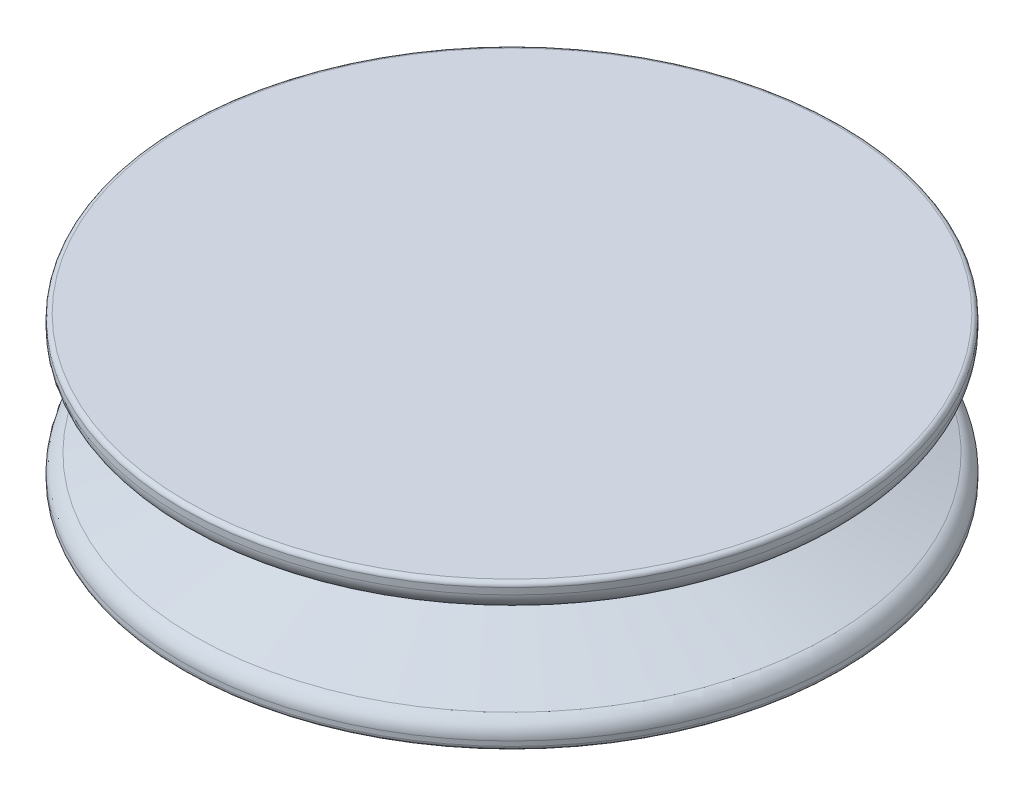
ISO-10303-21;
HEADER;
FILE_DESCRIPTION(('STEP AP214'),'2;1');
FILE_NAME('part.step','',(''),(''),'','','');
FILE_SCHEMA(('AUTOMOTIVE_DESIGN { 1 0 10303 214 1 1 1 1 }'));
ENDSEC;
DATA;
#1=APPLICATION_CONTEXT('core data for automotive mechanical design processes');
#2=APPLICATION_PROTOCOL_DEFINITION('international standard','automotive_design',2000,#1);
#3=PRODUCT_CONTEXT('',#1,'mechanical');
#4=PRODUCT('Part','Part','',(#3));
#5=PRODUCT_RELATED_PRODUCT_CATEGORY('part','',(#4));
#6=PRODUCT_DEFINITION_FORMATION('','',#4);
#7=PRODUCT_DEFINITION_CONTEXT('part definition',#1,'design');
#8=PRODUCT_DEFINITION('design','',#6,#7);
#9=PRODUCT_DEFINITION_SHAPE('','',#8);
#10=(LENGTH_UNIT() NAMED_UNIT(*) SI_UNIT(.MILLI.,.METRE.));
#11=(NAMED_UNIT(*) PLANE_ANGLE_UNIT() SI_UNIT($,.RADIAN.));
#12=(NAMED_UNIT(*) SI_UNIT($,.STERADIAN.) SOLID_ANGLE_UNIT());
#13=UNCERTAINTY_MEASURE_WITH_UNIT(LENGTH_MEASURE(1.E-05),#10,'distance_accuracy_value','');
#14=(GEOMETRIC_REPRESENTATION_CONTEXT(3) GLOBAL_UNCERTAINTY_ASSIGNED_CONTEXT((#13)) GLOBAL_UNIT_ASSIGNED_CONTEXT((#10,
#11,#12)) REPRESENTATION_CONTEXT('',''));
#15=CARTESIAN_POINT('',(0.,0.,0.));
#16=DIRECTION('',(0.,0.,1.));
#17=DIRECTION('',(1.,0.,0.));
#18=AXIS2_PLACEMENT_3D('',#15,#16,#17);
#19=CARTESIAN_POINT('',(0.,-66.4,0.));
#20=DIRECTION('',(0.,-1.,0.));
#21=DIRECTION('',(0.,0.,-1.));
#22=AXIS2_PLACEMENT_3D('',#19,#20,#21);
#23=PLANE('',#22);
#24=DIRECTION('',(-0.5,0.,0.866025403784439));
#25=VECTOR('',#24,1.);
#26=CARTESIAN_POINT('',(6.01887655630187,-66.4,11.425));
#27=LINE('',#26,#25);
#28=CARTESIAN_POINT('',(12.6151033817934,-66.4,0.));
#29=VERTEX_POINT('',#28);
#30=CARTESIAN_POINT('',(6.30755169089668,-66.4,10.925));
#31=VERTEX_POINT('',#30);
#32=EDGE_CURVE('E235',#29,#31,#27,.T.);
#33=ORIENTED_EDGE('',*,*,#32,.T.);
#34=DIRECTION('',(-1.,0.,0.));
#35=VECTOR('',#34,1.);
#36=CARTESIAN_POINT('',(-6.88490196008629,-66.4,10.925));
#37=LINE('',#36,#35);
#38=CARTESIAN_POINT('',(-6.30755169089668,-66.4,10.925));
#39=VERTEX_POINT('',#38);
#40=EDGE_CURVE('E237',#31,#39,#37,.T.);
#41=ORIENTED_EDGE('',*,*,#40,.T.);
#42=DIRECTION('',(-0.5,0.,-0.866025403784439));
#43=VECTOR('',#42,1.);
#44=CARTESIAN_POINT('',(-12.9037785163882,-66.4,-0.499999999999984));
#45=LINE('',#44,#43);
#46=CARTESIAN_POINT('',(-12.6151033817934,-66.4,0.));
#47=VERTEX_POINT('',#46);
#48=EDGE_CURVE('E229',#39,#47,#45,.T.);
#49=ORIENTED_EDGE('',*,*,#48,.T.);
#50=DIRECTION('',(0.5,0.,-0.866025403784439));
#51=VECTOR('',#50,1.);
#52=CARTESIAN_POINT('',(-6.01887655630188,-66.4,-11.425));
#53=LINE('',#52,#51);
#54=CARTESIAN_POINT('',(-6.30755169089668,-66.4,-10.925));
#55=VERTEX_POINT('',#54);
#56=EDGE_CURVE('E227',#47,#55,#53,.T.);
#57=ORIENTED_EDGE('',*,*,#56,.T.);
#58=DIRECTION('',(1.,0.,0.));
#59=VECTOR('',#58,1.);
#60=CARTESIAN_POINT('',(6.88490196008628,-66.4,-10.925));
#61=LINE('',#60,#59);
#62=CARTESIAN_POINT('',(6.30755169089668,-66.4,-10.925));
#63=VERTEX_POINT('',#62);
#64=EDGE_CURVE('E231',#55,#63,#61,.T.);
#65=ORIENTED_EDGE('',*,*,#64,.T.);
#66=DIRECTION('',(0.5,0.,0.866025403784439));
#67=VECTOR('',#66,1.);
#68=CARTESIAN_POINT('',(12.9037785163882,-66.4,0.499999999999988));
#69=LINE('',#68,#67);
#70=EDGE_CURVE('E233',#63,#29,#69,.T.);
#71=ORIENTED_EDGE('',*,*,#70,.T.);
#72=EDGE_LOOP('',(#33,#41,#49,#57,#65,#71));
#73=FACE_BOUND('',#72,.T.);
#74=CARTESIAN_POINT('',(0.,-66.4,0.));
#75=DIRECTION('',(0.,-1.,0.));
#76=DIRECTION('',(0.,0.,-1.));
#77=AXIS2_PLACEMENT_3D('',#74,#75,#76);
#78=CIRCLE('',#77,7.3);
#79=CARTESIAN_POINT('',(0.,-66.4,-7.3));
#80=VERTEX_POINT('',#79);
#81=EDGE_CURVE('E139',#80,#80,#78,.T.);
#82=ORIENTED_EDGE('',*,*,#81,.F.);
#83=EDGE_LOOP('',(#82));
#84=FACE_BOUND('',#83,.T.);
#85=ADVANCED_FACE('F45',(#73,#84),#23,.T.);
#86=CARTESIAN_POINT('',(0.,-51.8,0.));
#87=DIRECTION('',(0.,-1.,0.));
#88=DIRECTION('',(0.,0.,-1.));
#89=AXIS2_PLACEMENT_3D('',#86,#87,#88);
#90=PLANE('',#89);
#91=CARTESIAN_POINT('',(0.,-51.8,0.));
#92=DIRECTION('',(0.,-1.,0.));
#93=DIRECTION('',(0.,0.,-1.));
#94=AXIS2_PLACEMENT_3D('',#91,#92,#93);
#95=CIRCLE('',#94,19.5);
#96=CARTESIAN_POINT('',(0.,-51.8,-19.5));
#97=VERTEX_POINT('',#96);
#98=EDGE_CURVE('E128',#97,#97,#95,.T.);
#99=ORIENTED_EDGE('',*,*,#98,.T.);
#100=EDGE_LOOP('',(#99));
#101=FACE_BOUND('',#100,.T.);
#102=DIRECTION('',(-0.5,0.,-0.866025403784439));
#103=VECTOR('',#102,1.);
#104=CARTESIAN_POINT('',(-6.88490196008629,-51.8,11.925));
#105=LINE('',#104,#103);
#106=CARTESIAN_POINT('',(-6.88490196008629,-51.8,11.925));
#107=VERTEX_POINT('',#106);
#108=CARTESIAN_POINT('',(-13.7698039201726,-51.8,0.));
#109=VERTEX_POINT('',#108);
#110=EDGE_CURVE('E121',#107,#109,#105,.T.);
#111=ORIENTED_EDGE('',*,*,#110,.F.);
#112=DIRECTION('',(-1.,0.,0.));
#113=VECTOR('',#112,1.);
#114=CARTESIAN_POINT('',(6.88490196008629,-51.8,11.925));
#115=LINE('',#114,#113);
#116=CARTESIAN_POINT('',(6.88490196008629,-51.8,11.925));
#117=VERTEX_POINT('',#116);
#118=EDGE_CURVE('E132',#117,#107,#115,.T.);
#119=ORIENTED_EDGE('',*,*,#118,.F.);
#120=DIRECTION('',(-0.5,0.,0.866025403784439));
#121=VECTOR('',#120,1.);
#122=CARTESIAN_POINT('',(13.7698039201726,-51.8,0.));
#123=LINE('',#122,#121);
#124=CARTESIAN_POINT('',(13.7698039201726,-51.8,0.));
#125=VERTEX_POINT('',#124);
#126=EDGE_CURVE('E155',#125,#117,#123,.T.);
#127=ORIENTED_EDGE('',*,*,#126,.F.);
#128=DIRECTION('',(0.5,0.,0.866025403784438));
#129=VECTOR('',#128,1.);
#130=CARTESIAN_POINT('',(6.88490196008628,-51.8,-11.925));
#131=LINE('',#130,#129);
#132=CARTESIAN_POINT('',(6.88490196008628,-51.8,-11.925));
#133=VERTEX_POINT('',#132);
#134=EDGE_CURVE('E152',#133,#125,#131,.T.);
#135=ORIENTED_EDGE('',*,*,#134,.F.);
#136=DIRECTION('',(1.,0.,0.));
#137=VECTOR('',#136,1.);
#138=CARTESIAN_POINT('',(-6.88490196008629,-51.8,-11.925));
#139=LINE('',#138,#137);
#140=CARTESIAN_POINT('',(-6.88490196008629,-51.8,-11.925));
#141=VERTEX_POINT('',#140);
#142=EDGE_CURVE('E146',#141,#133,#139,.T.);
#143=ORIENTED_EDGE('',*,*,#142,.F.);
#144=DIRECTION('',(0.5,0.,-0.866025403784439));
#145=VECTOR('',#144,1.);
#146=CARTESIAN_POINT('',(-13.7698039201726,-51.8,0.));
#147=LINE('',#146,#145);
#148=EDGE_CURVE('E144',#109,#141,#147,.T.);
#149=ORIENTED_EDGE('',*,*,#148,.F.);
#150=EDGE_LOOP('',(#111,#119,#127,#135,#143,#149));
#151=FACE_BOUND('',#150,.T.);
#152=ADVANCED_FACE('F141',(#101,#151),#90,.T.);
#153=CARTESIAN_POINT('',(0.,-6.30000000000001,0.));
#154=DIRECTION('',(0.,1.,0.));
#155=DIRECTION('',(0.,0.,1.));
#156=AXIS2_PLACEMENT_3D('',#153,#154,#155);
#157=CONICAL_SURFACE('',#156,76.2,1.52716309549505);
#158=CARTESIAN_POINT('',(0.,-8.71198851213093,0.));
#159=DIRECTION('',(0.,-1.,0.));
#160=DIRECTION('',(0.,0.,-1.));
#161=AXIS2_PLACEMENT_3D('',#158,#159,#160);
#162=CIRCLE('',#161,20.9563806126347);
#163=CARTESIAN_POINT('',(0.,-8.71198851213093,20.9563806126347));
#164=VERTEX_POINT('',#163);
#165=EDGE_CURVE('E11',#164,#164,#162,.F.);
#166=CARTESIAN_POINT('',(0.,-6.46702591730818,0.));
#167=DIRECTION('',(0.,-1.,0.));
#168=DIRECTION('',(0.,0.,-1.));
#169=AXIS2_PLACEMENT_3D('',#166,#167,#168);
#170=CIRCLE('',#169,72.3744775494613);
#171=CARTESIAN_POINT('',(0.,-6.46702591730818,72.3744775494613));
#172=VERTEX_POINT('',#171);
#173=EDGE_CURVE('E176',#172,#172,#170,.T.);
#174=CARTESIAN_POINT('',(0.,-8.71198851213093,20.9563806126347));
#175=CARTESIAN_POINT('',(0.,-8.68860348510153,21.49198578906));
#176=CARTESIAN_POINT('',(0.,-8.66521845807212,22.0275909654853));
#177=CARTESIAN_POINT('',(0.,-8.61844840401332,23.0988013183358));
#178=CARTESIAN_POINT('',(0.,-8.59506337698391,23.6344064947611));
#179=CARTESIAN_POINT('',(0.,-8.5482933229251,24.7056168476116));
#180=CARTESIAN_POINT('',(0.,-8.5249082958957,25.2412220240369));
#181=CARTESIAN_POINT('',(0.,-8.47813824183689,26.3124323768875));
#182=CARTESIAN_POINT('',(0.,-8.45475321480749,26.8480375533127));
#183=CARTESIAN_POINT('',(0.,-8.40798316074868,27.9192479061633));
#184=CARTESIAN_POINT('',(0.,-8.38459813371928,28.4548530825886));
#185=CARTESIAN_POINT('',(0.,-8.33782807966047,29.5260634354391));
#186=CARTESIAN_POINT('',(0.,-8.31444305263107,30.0616686118644));
#187=CARTESIAN_POINT('',(0.,-8.26767299857226,31.132878964715));
#188=CARTESIAN_POINT('',(0.,-8.24428797154286,31.6684841411402));
#189=CARTESIAN_POINT('',(0.,-8.19751791748405,32.7396944939908));
#190=CARTESIAN_POINT('',(0.,-8.17413289045465,33.2752996704161));
#191=CARTESIAN_POINT('',(0.,-8.12736283639584,34.3465100232666));
#192=CARTESIAN_POINT('',(0.,-8.10397780936644,34.8821151996919));
#193=CARTESIAN_POINT('',(0.,-8.05720775530763,35.9533255525425));
#194=CARTESIAN_POINT('',(0.,-8.03382272827823,36.4889307289677));
#195=CARTESIAN_POINT('',(0.,-7.98705267421942,37.5601410818183));
#196=CARTESIAN_POINT('',(0.,-7.96366764719002,38.0957462582436));
#197=CARTESIAN_POINT('',(0.,-7.91689759313121,39.1669566110941));
#198=CARTESIAN_POINT('',(0.,-7.8935125661018,39.7025617875194));
#199=CARTESIAN_POINT('',(0.,-7.846742512043,40.7737721403699));
#200=CARTESIAN_POINT('',(0.,-7.82335748501359,41.3093773167952));
#201=CARTESIAN_POINT('',(0.,-7.77658743095479,42.3805876696458));
#202=CARTESIAN_POINT('',(0.,-7.75320240392538,42.9161928460711));
#203=CARTESIAN_POINT('',(0.,-7.70643234986658,43.9874031989216));
#204=CARTESIAN_POINT('',(0.,-7.68304732283717,44.5230083753469));
#205=CARTESIAN_POINT('',(0.,-7.63627726877836,45.5942187281974));
#206=CARTESIAN_POINT('',(0.,-7.61289224174896,46.1298239046227));
#207=CARTESIAN_POINT('',(0.,-7.56612218769015,47.2010342574733));
#208=CARTESIAN_POINT('',(0.,-7.54273716066075,47.7366394338985));
#209=CARTESIAN_POINT('',(0.,-7.49596710660194,48.8078497867491));
#210=CARTESIAN_POINT('',(0.,-7.47258207957254,49.3434549631744));
#211=CARTESIAN_POINT('',(0.,-7.42581202551373,50.4146653160249));
#212=CARTESIAN_POINT('',(0.,-7.40242699848433,50.9502704924502));
#213=CARTESIAN_POINT('',(0.,-7.35565694442552,52.0214808453008));
#214=CARTESIAN_POINT('',(0.,-7.33227191739612,52.5570860217261));
#215=CARTESIAN_POINT('',(0.,-7.28550186333731,53.6282963745766));
#216=CARTESIAN_POINT('',(0.,-7.26211683630791,54.1639015510019));
#217=CARTESIAN_POINT('',(0.,-7.2153467822491,55.2351119038524));
#218=CARTESIAN_POINT('',(0.,-7.1919617552197,55.7707170802777));
#219=CARTESIAN_POINT('',(0.,-7.14519170116089,56.8419274331283));
#220=CARTESIAN_POINT('',(0.,-7.12180667413148,57.3775326095535));
#221=CARTESIAN_POINT('',(0.,-7.07503662007268,58.4487429624041));
#222=CARTESIAN_POINT('',(0.,-7.05165159304327,58.9843481388294));
#223=CARTESIAN_POINT('',(0.,-7.00488153898447,60.0555584916799));
#224=CARTESIAN_POINT('',(0.,-6.98149651195506,60.5911636681052));
#225=CARTESIAN_POINT('',(0.,-6.93472645789626,61.6623740209558));
#226=CARTESIAN_POINT('',(0.,-6.91134143086685,62.197979197381));
#227=CARTESIAN_POINT('',(0.,-6.86457137680804,63.2691895502316));
#228=CARTESIAN_POINT('',(0.,-6.84118634977864,63.8047947266569));
#229=CARTESIAN_POINT('',(0.,-6.79441629571983,64.8760050795074));
#230=CARTESIAN_POINT('',(0.,-6.77103126869043,65.4116102559327));
#231=CARTESIAN_POINT('',(0.,-6.72426121463162,66.4828206087832));
#232=CARTESIAN_POINT('',(0.,-6.70087618760222,67.0184257852085));
#233=CARTESIAN_POINT('',(0.,-6.65410613354341,68.0896361380591));
#234=CARTESIAN_POINT('',(0.,-6.63072110651401,68.6252413144843));
#235=CARTESIAN_POINT('',(0.,-6.5839510524552,69.6964516673349));
#236=CARTESIAN_POINT('',(0.,-6.5605660254258,70.2320568437602));
#237=CARTESIAN_POINT('',(0.,-6.51379597136699,71.3032671966107));
#238=CARTESIAN_POINT('',(0.,-6.49041094433759,71.838872373036));
#239=CARTESIAN_POINT('',(0.,-6.46702591730818,72.3744775494613));
#240=B_SPLINE_CURVE_WITH_KNOTS('',3,(#174,#175,#176,#177,#178,#179,#180,#181,#182,#183,#184,
#185,#186,#187,#188,#189,#190,#191,#192,#193,#194,#195,#196,#197,#198,#199,#200,#201,#202,#203,
#204,#205,#206,#207,#208,#209,#210,#211,#212,#213,#214,#215,#216,#217,#218,#219,#220,#221,#222,
#223,#224,#225,#226,#227,#228,#229,#230,#231,#232,#233,#234,#235,#236,#237,#238,#239),
.UNSPECIFIED.,.F.,.F.,(4,2,2,2,2,2,2,2,2,2,2,2,2,2,2,2,2,2,2,2,2,2,2,2,2,2,2,2,2,2,2,2,4),(0.,
1.60834631859076,3.21669263718153,4.82503895577229,6.43338527436305,8.04173159295382,
9.65007791154458,11.2584242301353,12.8667705487261,14.4751168673169,16.0834631859076,
17.6918095044984,19.3001558230892,20.9085021416799,22.5168484602707,24.1251947788615,
25.7335410974522,27.341887416043,28.9502337346337,30.5585800532245,32.1669263718153,
33.775272690406,35.3836190089968,36.9919653275876,38.6003116461783,40.2086579647691,
41.8170042833599,43.4253506019506,45.0336969205414,46.6420432391321,48.2503895577229,
49.8587358763137,51.4670821949044),.UNSPECIFIED.);
#241=EDGE_CURVE('BSEAM300',#164,#172,#240,.T.);
#242=ORIENTED_EDGE('',*,*,#165,.T.);
#243=ORIENTED_EDGE('',*,*,#173,.T.);
#244=ORIENTED_EDGE('',*,*,#241,.T.);
#245=ORIENTED_EDGE('',*,*,#241,.F.);
#246=EDGE_LOOP('',(#242,#244,#243,#245));
#247=FACE_BOUND('',#246,.T.);
#248=ADVANCED_FACE('F300',(#247),#157,.T.);
#249=CARTESIAN_POINT('',(0.,0.,0.));
#250=DIRECTION('',(0.,-1.,0.));
#251=DIRECTION('',(0.,0.,-1.));
#252=AXIS2_PLACEMENT_3D('',#249,#250,#251);
#253=CYLINDRICAL_SURFACE('',#252,76.2);
#254=CARTESIAN_POINT('',(0.,-1.,0.));
#255=DIRECTION('',(0.,-1.,0.));
#256=DIRECTION('',(0.,0.,-1.));
#257=AXIS2_PLACEMENT_3D('',#254,#255,#256);
#258=CIRCLE('',#257,76.2);
#259=CARTESIAN_POINT('',(0.,-1.,-76.2));
#260=VERTEX_POINT('',#259);
#261=EDGE_CURVE('E194',#260,#260,#258,.T.);
#262=ORIENTED_EDGE('',*,*,#261,.T.);
#263=EDGE_LOOP('',(#262));
#264=FACE_BOUND('',#263,.T.);
#265=CARTESIAN_POINT('',(0.,-2.47083303098075,0.));
#266=DIRECTION('',(0.,1.,0.));
#267=DIRECTION('',(0.,0.,1.));
#268=AXIS2_PLACEMENT_3D('',#265,#266,#267);
#269=CIRCLE('',#268,76.2);
#270=CARTESIAN_POINT('',(0.,-2.47083303098075,76.2));
#271=VERTEX_POINT('',#270);
#272=EDGE_CURVE('E179',#271,#271,#269,.T.);
#273=ORIENTED_EDGE('',*,*,#272,.T.);
#274=EDGE_LOOP('',(#273));
#275=FACE_BOUND('',#274,.T.);
#276=ADVANCED_FACE('F303',(#264,#275),#253,.T.);
#277=CARTESIAN_POINT('',(0.,0.,0.));
#278=DIRECTION('',(0.,-1.,0.));
#279=DIRECTION('',(0.,0.,-1.));
#280=AXIS2_PLACEMENT_3D('',#277,#278,#279);
#281=PLANE('',#280);
#282=CARTESIAN_POINT('',(0.,0.,0.));
#283=DIRECTION('',(0.,-1.,0.));
#284=DIRECTION('',(0.,0.,-1.));
#285=AXIS2_PLACEMENT_3D('',#282,#283,#284);
#286=CIRCLE('',#285,75.2);
#287=CARTESIAN_POINT('',(0.,0.,-75.2));
#288=VERTEX_POINT('',#287);
#289=EDGE_CURVE('E197',#288,#288,#286,.F.);
#290=ORIENTED_EDGE('',*,*,#289,.T.);
#291=EDGE_LOOP('',(#290));
#292=FACE_BOUND('',#291,.T.);
#293=ADVANCED_FACE('F292',(#292),#281,.F.);
#294=CARTESIAN_POINT('',(0.,-12.5,0.));
#295=DIRECTION('',(0.,1.,0.));
#296=DIRECTION('',(0.,0.,1.));
#297=AXIS2_PLACEMENT_3D('',#294,#295,#296);
#298=CYLINDRICAL_SURFACE('',#297,20.);
#299=CARTESIAN_POINT('',(0.,-11.5,0.));
#300=DIRECTION('',(0.,-1.,0.));
#301=DIRECTION('',(0.,0.,-1.));
#302=AXIS2_PLACEMENT_3D('',#299,#300,#301);
#303=CIRCLE('',#302,20.);
#304=CARTESIAN_POINT('',(0.,-11.5,-20.));
#305=VERTEX_POINT('',#304);
#306=EDGE_CURVE('E274',#305,#305,#303,.F.);
#307=ORIENTED_EDGE('',*,*,#306,.T.);
#308=EDGE_LOOP('',(#307));
#309=FACE_BOUND('',#308,.T.);
#310=CARTESIAN_POINT('',(0.,-9.71103673371279,0.));
#311=DIRECTION('',(0.,1.,0.));
#312=DIRECTION('',(0.,0.,1.));
#313=AXIS2_PLACEMENT_3D('',#310,#311,#312);
#314=CIRCLE('',#313,20.);
#315=CARTESIAN_POINT('',(0.,-9.71103673371279,20.));
#316=VERTEX_POINT('',#315);
#317=EDGE_CURVE('E271',#316,#316,#314,.F.);
#318=ORIENTED_EDGE('',*,*,#317,.T.);
#319=EDGE_LOOP('',(#318));
#320=FACE_BOUND('',#319,.T.);
#321=ADVANCED_FACE('F288',(#309,#320),#298,.T.);
#322=CARTESIAN_POINT('',(0.,-30.6999793237055,0.));
#323=DIRECTION('',(0.,-1.,0.));
#324=DIRECTION('',(0.,0.,-1.));
#325=AXIS2_PLACEMENT_3D('',#322,#323,#324);
#326=CONICAL_SURFACE('',#325,73.6,1.25663706143592);
#327=CARTESIAN_POINT('',(0.,-20.4650088923692,0.));
#328=DIRECTION('',(0.,-1.,0.));
#329=DIRECTION('',(0.,0.,-1.));
#330=AXIS2_PLACEMENT_3D('',#327,#328,#329);
#331=CIRCLE('',#330,42.1);
#332=CARTESIAN_POINT('',(0.,-20.4650088923692,-42.1));
#333=VERTEX_POINT('',#332);
#334=EDGE_CURVE('E167',#333,#333,#331,.T.);
#335=ORIENTED_EDGE('',*,*,#334,.F.);
#336=EDGE_LOOP('',(#335));
#337=FACE_BOUND('',#336,.T.);
#338=CARTESIAN_POINT('',(0.,-30.16114575181,0.));
#339=DIRECTION('',(0.,-1.,0.));
#340=DIRECTION('',(0.,0.,-1.));
#341=AXIS2_PLACEMENT_3D('',#338,#339,#340);
#342=CIRCLE('',#341,71.9416407864999);
#343=CARTESIAN_POINT('',(0.,-30.16114575181,-71.9416407864999));
#344=VERTEX_POINT('',#343);
#345=EDGE_CURVE('E200',#344,#344,#342,.T.);
#346=ORIENTED_EDGE('',*,*,#345,.T.);
#347=EDGE_LOOP('',(#346));
#348=FACE_BOUND('',#347,.T.);
#349=ADVANCED_FACE('F291',(#337,#348),#326,.F.);
#350=CARTESIAN_POINT('',(-26.,-12.5,0.));
#351=DIRECTION('',(0.,-1.,0.));
#352=DIRECTION('',(0.,0.,-1.));
#353=AXIS2_PLACEMENT_3D('',#350,#351,#352);
#354=PLANE('',#353);
#355=CARTESIAN_POINT('',(0.,-12.5,0.));
#356=DIRECTION('',(0.,-1.,0.));
#357=DIRECTION('',(0.,0.,-1.));
#358=AXIS2_PLACEMENT_3D('',#355,#356,#357);
#359=CIRCLE('',#358,21.);
#360=CARTESIAN_POINT('',(0.,-12.5,-21.));
#361=VERTEX_POINT('',#360);
#362=EDGE_CURVE('E53',#361,#361,#359,.T.);
#363=ORIENTED_EDGE('',*,*,#362,.T.);
#364=EDGE_LOOP('',(#363));
#365=FACE_BOUND('',#364,.T.);
#366=CARTESIAN_POINT('',(0.,-12.5,0.));
#367=DIRECTION('',(0.,-1.,0.));
#368=DIRECTION('',(0.,0.,-1.));
#369=AXIS2_PLACEMENT_3D('',#366,#367,#368);
#370=CIRCLE('',#369,24.4161555967547);
#371=CARTESIAN_POINT('',(0.,-12.5,-24.4161555967547));
#372=VERTEX_POINT('',#371);
#373=EDGE_CURVE('E209',#372,#372,#370,.F.);
#374=ORIENTED_EDGE('',*,*,#373,.T.);
#375=EDGE_LOOP('',(#374));
#376=FACE_BOUND('',#375,.T.);
#377=ADVANCED_FACE('F279',(#365,#376),#354,.F.);
#378=CARTESIAN_POINT('',(0.,-12.5,0.));
#379=DIRECTION('',(0.,-1.,0.));
#380=DIRECTION('',(0.,0.,-1.));
#381=AXIS2_PLACEMENT_3D('',#378,#379,#380);
#382=CONICAL_SURFACE('',#381,26.,1.25663706143592);
#383=CARTESIAN_POINT('',(0.,-12.9894348370484,0.));
#384=DIRECTION('',(0.,1.,0.));
#385=DIRECTION('',(0.,0.,1.));
#386=AXIS2_PLACEMENT_3D('',#383,#384,#385);
#387=CIRCLE('',#386,27.5063255405041);
#388=CARTESIAN_POINT('',(0.,-12.9894348370484,27.5063255405041));
#389=VERTEX_POINT('',#388);
#390=EDGE_CURVE('E206',#389,#389,#387,.F.);
#391=ORIENTED_EDGE('',*,*,#390,.T.);
#392=EDGE_LOOP('',(#391));
#393=FACE_BOUND('',#392,.T.);
#394=CARTESIAN_POINT('',(0.,-27.9129127977324,0.));
#395=DIRECTION('',(0.,1.,0.));
#396=DIRECTION('',(0.,0.,1.));
#397=AXIS2_PLACEMENT_3D('',#394,#395,#396);
#398=CIRCLE('',#397,73.4360679774998);
#399=CARTESIAN_POINT('',(0.,-27.9129127977324,73.4360679774998));
#400=VERTEX_POINT('',#399);
#401=EDGE_CURVE('E173',#400,#400,#398,.T.);
#402=ORIENTED_EDGE('',*,*,#401,.T.);
#403=EDGE_LOOP('',(#402));
#404=FACE_BOUND('',#403,.T.);
#405=ADVANCED_FACE('F380',(#393,#404),#382,.T.);
#406=CARTESIAN_POINT('',(0.,0.,0.));
#407=DIRECTION('',(0.,-1.,0.));
#408=DIRECTION('',(0.,0.,-1.));
#409=AXIS2_PLACEMENT_3D('',#406,#407,#408);
#410=CYLINDRICAL_SURFACE('',#409,76.2);
#411=CARTESIAN_POINT('',(0.,-32.8,0.));
#412=DIRECTION('',(0.,1.,0.));
#413=DIRECTION('',(0.,0.,1.));
#414=AXIS2_PLACEMENT_3D('',#411,#412,#413);
#415=CIRCLE('',#414,76.2);
#416=CARTESIAN_POINT('',(0.,-32.8,76.2));
#417=VERTEX_POINT('',#416);
#418=EDGE_CURVE('E191',#417,#417,#415,.T.);
#419=ORIENTED_EDGE('',*,*,#418,.T.);
#420=EDGE_LOOP('',(#419));
#421=FACE_BOUND('',#420,.T.);
#422=CARTESIAN_POINT('',(0.,-31.717138862913,0.));
#423=DIRECTION('',(0.,1.,0.));
#424=DIRECTION('',(0.,0.,1.));
#425=AXIS2_PLACEMENT_3D('',#422,#423,#424);
#426=CIRCLE('',#425,76.2);
#427=CARTESIAN_POINT('',(0.,-31.717138862913,76.2));
#428=VERTEX_POINT('',#427);
#429=EDGE_CURVE('E170',#428,#428,#426,.F.);
#430=ORIENTED_EDGE('',*,*,#429,.T.);
#431=EDGE_LOOP('',(#430));
#432=FACE_BOUND('',#431,.T.);
#433=ADVANCED_FACE('F376',(#421,#432),#410,.T.);
#434=CARTESIAN_POINT('',(-76.2,-33.8,0.));
#435=DIRECTION('',(0.,1.,0.));
#436=DIRECTION('',(0.,0.,1.));
#437=AXIS2_PLACEMENT_3D('',#434,#435,#436);
#438=PLANE('',#437);
#439=CARTESIAN_POINT('',(0.,-33.8,0.));
#440=DIRECTION('',(0.,1.,0.));
#441=DIRECTION('',(0.,0.,1.));
#442=AXIS2_PLACEMENT_3D('',#439,#440,#441);
#443=CIRCLE('',#442,74.6);
#444=CARTESIAN_POINT('',(0.,-33.8,74.6));
#445=VERTEX_POINT('',#444);
#446=EDGE_CURVE('E188',#445,#445,#443,.T.);
#447=ORIENTED_EDGE('',*,*,#446,.T.);
#448=EDGE_LOOP('',(#447));
#449=FACE_BOUND('',#448,.T.);
#450=CARTESIAN_POINT('',(0.,-33.8,0.));
#451=DIRECTION('',(0.,1.,0.));
#452=DIRECTION('',(0.,0.,1.));
#453=AXIS2_PLACEMENT_3D('',#450,#451,#452);
#454=CIRCLE('',#453,75.2);
#455=CARTESIAN_POINT('',(0.,-33.8,75.2));
#456=VERTEX_POINT('',#455);
#457=EDGE_CURVE('E185',#456,#456,#454,.F.);
#458=ORIENTED_EDGE('',*,*,#457,.T.);
#459=EDGE_LOOP('',(#458));
#460=FACE_BOUND('',#459,.T.);
#461=ADVANCED_FACE('F372',(#449,#460),#438,.F.);
#462=CARTESIAN_POINT('',(0.,0.,0.));
#463=DIRECTION('',(0.,-1.,0.));
#464=DIRECTION('',(0.,0.,-1.));
#465=AXIS2_PLACEMENT_3D('',#462,#463,#464);
#466=CYLINDRICAL_SURFACE('',#465,73.6);
#467=CARTESIAN_POINT('',(0.,-32.4436813909184,0.));
#468=DIRECTION('',(0.,-1.,0.));
#469=DIRECTION('',(0.,0.,-1.));
#470=AXIS2_PLACEMENT_3D('',#467,#468,#469);
#471=CIRCLE('',#470,73.6);
#472=CARTESIAN_POINT('',(0.,-32.4436813909184,-73.6));
#473=VERTEX_POINT('',#472);
#474=EDGE_CURVE('E203',#473,#473,#471,.F.);
#475=ORIENTED_EDGE('',*,*,#474,.T.);
#476=EDGE_LOOP('',(#475));
#477=FACE_BOUND('',#476,.T.);
#478=CARTESIAN_POINT('',(0.,-32.8,0.));
#479=DIRECTION('',(0.,1.,0.));
#480=DIRECTION('',(0.,0.,1.));
#481=AXIS2_PLACEMENT_3D('',#478,#479,#480);
#482=CIRCLE('',#481,73.6);
#483=CARTESIAN_POINT('',(0.,-32.8,73.6));
#484=VERTEX_POINT('',#483);
#485=EDGE_CURVE('E182',#484,#484,#482,.F.);
#486=ORIENTED_EDGE('',*,*,#485,.T.);
#487=EDGE_LOOP('',(#486));
#488=FACE_BOUND('',#487,.T.);
#489=ADVANCED_FACE('F320',(#477,#488),#466,.F.);
#490=CARTESIAN_POINT('',(0.,-31.717138862913,0.));
#491=DIRECTION('',(0.,1.,0.));
#492=DIRECTION('',(0.,0.,1.));
#493=AXIS2_PLACEMENT_3D('',#490,#491,#492);
#494=TOROIDAL_SURFACE('',#493,72.2,4.);
#495=ORIENTED_EDGE('',*,*,#401,.F.);
#496=EDGE_LOOP('',(#495));
#497=FACE_BOUND('',#496,.T.);
#498=ORIENTED_EDGE('',*,*,#429,.F.);
#499=EDGE_LOOP('',(#498));
#500=FACE_BOUND('',#499,.T.);
#501=ADVANCED_FACE('F310',(#497,#500),#494,.T.);
#502=CARTESIAN_POINT('',(0.,-2.47083303098075,0.));
#503=DIRECTION('',(0.,1.,0.));
#504=DIRECTION('',(0.,0.,1.));
#505=AXIS2_PLACEMENT_3D('',#502,#503,#504);
#506=TOROIDAL_SURFACE('',#505,72.2,4.);
#507=ORIENTED_EDGE('',*,*,#272,.F.);
#508=EDGE_LOOP('',(#507));
#509=FACE_BOUND('',#508,.T.);
#510=ORIENTED_EDGE('',*,*,#173,.F.);
#511=EDGE_LOOP('',(#510));
#512=FACE_BOUND('',#511,.T.);
#513=ADVANCED_FACE('F307',(#509,#512),#506,.T.);
#514=CARTESIAN_POINT('',(0.,-32.8,0.));
#515=DIRECTION('',(0.,1.,0.));
#516=DIRECTION('',(0.,0.,1.));
#517=AXIS2_PLACEMENT_3D('',#514,#515,#516);
#518=TOROIDAL_SURFACE('',#517,74.6,1.);
#519=ORIENTED_EDGE('',*,*,#446,.F.);
#520=EDGE_LOOP('',(#519));
#521=FACE_BOUND('',#520,.T.);
#522=ORIENTED_EDGE('',*,*,#485,.F.);
#523=EDGE_LOOP('',(#522));
#524=FACE_BOUND('',#523,.T.);
#525=ADVANCED_FACE('F309',(#521,#524),#518,.T.);
#526=CARTESIAN_POINT('',(0.,-32.8,0.));
#527=DIRECTION('',(0.,1.,0.));
#528=DIRECTION('',(0.,0.,1.));
#529=AXIS2_PLACEMENT_3D('',#526,#527,#528);
#530=TOROIDAL_SURFACE('',#529,75.2,1.);
#531=ORIENTED_EDGE('',*,*,#418,.F.);
#532=EDGE_LOOP('',(#531));
#533=FACE_BOUND('',#532,.T.);
#534=ORIENTED_EDGE('',*,*,#457,.F.);
#535=EDGE_LOOP('',(#534));
#536=FACE_BOUND('',#535,.T.);
#537=ADVANCED_FACE('F317',(#533,#536),#530,.T.);
#538=CARTESIAN_POINT('',(0.,-1.,0.));
#539=DIRECTION('',(0.,-1.,0.));
#540=DIRECTION('',(0.,0.,-1.));
#541=AXIS2_PLACEMENT_3D('',#538,#539,#540);
#542=TOROIDAL_SURFACE('',#541,75.2,1.);
#543=ORIENTED_EDGE('',*,*,#289,.F.);
#544=EDGE_LOOP('',(#543));
#545=FACE_BOUND('',#544,.T.);
#546=ORIENTED_EDGE('',*,*,#261,.F.);
#547=EDGE_LOOP('',(#546));
#548=FACE_BOUND('',#547,.T.);
#549=ADVANCED_FACE('F400',(#545,#548),#542,.T.);
#550=CARTESIAN_POINT('',(0.,-32.4436813909184,0.));
#551=DIRECTION('',(0.,-1.,0.));
#552=DIRECTION('',(0.,0.,-1.));
#553=AXIS2_PLACEMENT_3D('',#550,#551,#552);
#554=TOROIDAL_SURFACE('',#553,71.2,2.4);
#555=ORIENTED_EDGE('',*,*,#474,.F.);
#556=EDGE_LOOP('',(#555));
#557=FACE_BOUND('',#556,.T.);
#558=ORIENTED_EDGE('',*,*,#345,.F.);
#559=EDGE_LOOP('',(#558));
#560=FACE_BOUND('',#559,.T.);
#561=ADVANCED_FACE('F402',(#557,#560),#554,.F.);
#562=CARTESIAN_POINT('',(0.,-22.5,0.));
#563=DIRECTION('',(0.,-1.,0.));
#564=DIRECTION('',(0.,0.,-1.));
#565=AXIS2_PLACEMENT_3D('',#562,#563,#564);
#566=TOROIDAL_SURFACE('',#565,24.4161555967547,10.);
#567=ORIENTED_EDGE('',*,*,#373,.F.);
#568=EDGE_LOOP('',(#567));
#569=FACE_BOUND('',#568,.T.);
#570=ORIENTED_EDGE('',*,*,#390,.F.);
#571=EDGE_LOOP('',(#570));
#572=FACE_BOUND('',#571,.T.);
#573=ADVANCED_FACE('F364',(#569,#572),#566,.T.);
#574=CARTESIAN_POINT('',(0.,-54.1,0.));
#575=DIRECTION('',(0.,-1.,0.));
#576=DIRECTION('',(0.,0.,-1.));
#577=AXIS2_PLACEMENT_3D('',#574,#575,#576);
#578=PLANE('',#577);
#579=CARTESIAN_POINT('',(0.,-54.1,0.));
#580=DIRECTION('',(0.,-1.,0.));
#581=DIRECTION('',(0.,0.,-1.));
#582=AXIS2_PLACEMENT_3D('',#579,#580,#581);
#583=CIRCLE('',#582,20.);
#584=CARTESIAN_POINT('',(0.,-54.1,-20.));
#585=VERTEX_POINT('',#584);
#586=EDGE_CURVE('E268',#585,#585,#583,.F.);
#587=ORIENTED_EDGE('',*,*,#586,.T.);
#588=EDGE_LOOP('',(#587));
#589=FACE_BOUND('',#588,.T.);
#590=CARTESIAN_POINT('',(0.,-54.1,0.));
#591=DIRECTION('',(0.,-1.,0.));
#592=DIRECTION('',(0.,0.,-1.));
#593=AXIS2_PLACEMENT_3D('',#590,#591,#592);
#594=CIRCLE('',#593,30.7574363607646);
#595=CARTESIAN_POINT('',(0.,-54.1,-30.7574363607646));
#596=VERTEX_POINT('',#595);
#597=EDGE_CURVE('E212',#596,#596,#594,.T.);
#598=ORIENTED_EDGE('',*,*,#597,.T.);
#599=EDGE_LOOP('',(#598));
#600=FACE_BOUND('',#599,.T.);
#601=ADVANCED_FACE('F360',(#589,#600),#578,.T.);
#602=CARTESIAN_POINT('',(0.,0.000999999999994061,0.));
#603=DIRECTION('',(0.,-1.,0.));
#604=DIRECTION('',(0.,0.,-1.));
#605=AXIS2_PLACEMENT_3D('',#602,#603,#604);
#606=CYLINDRICAL_SURFACE('',#605,42.1);
#607=CARTESIAN_POINT('',(0.,-50.4218007376454,0.));
#608=DIRECTION('',(0.,-1.,0.));
#609=DIRECTION('',(0.,0.,-1.));
#610=AXIS2_PLACEMENT_3D('',#607,#608,#609);
#611=CIRCLE('',#610,42.1);
#612=CARTESIAN_POINT('',(0.,-50.4218007376454,-42.1));
#613=VERTEX_POINT('',#612);
#614=EDGE_CURVE('E215',#613,#613,#611,.F.);
#615=ORIENTED_EDGE('',*,*,#614,.T.);
#616=EDGE_LOOP('',(#615));
#617=FACE_BOUND('',#616,.T.);
#618=ORIENTED_EDGE('',*,*,#334,.T.);
#619=EDGE_LOOP('',(#618));
#620=FACE_BOUND('',#619,.T.);
#621=ADVANCED_FACE('F363',(#617,#620),#606,.T.);
#622=CARTESIAN_POINT('',(0.,-54.1,0.));
#623=DIRECTION('',(0.,1.,0.));
#624=DIRECTION('',(0.,0.,1.));
#625=AXIS2_PLACEMENT_3D('',#622,#623,#624);
#626=CONICAL_SURFACE('',#625,30.7574363607646,1.39626340159546);
#627=CARTESIAN_POINT('',(0.,-52.3914162436699,0.));
#628=DIRECTION('',(0.,-1.,0.));
#629=DIRECTION('',(0.,0.,-1.));
#630=AXIS2_PLACEMENT_3D('',#627,#628,#629);
#631=CIRCLE('',#630,40.4472963553339);
#632=CARTESIAN_POINT('',(0.,-52.3914162436699,-40.4472963553339));
#633=VERTEX_POINT('',#632);
#634=EDGE_CURVE('E218',#633,#633,#631,.T.);
#635=ORIENTED_EDGE('',*,*,#634,.T.);
#636=EDGE_LOOP('',(#635));
#637=FACE_BOUND('',#636,.T.);
#638=ORIENTED_EDGE('',*,*,#597,.F.);
#639=EDGE_LOOP('',(#638));
#640=FACE_BOUND('',#639,.T.);
#641=ADVANCED_FACE('F368',(#637,#640),#626,.T.);
#642=CARTESIAN_POINT('',(0.,-50.4218007376454,0.));
#643=DIRECTION('',(0.,-1.,0.));
#644=DIRECTION('',(0.,0.,-1.));
#645=AXIS2_PLACEMENT_3D('',#642,#643,#644);
#646=TOROIDAL_SURFACE('',#645,40.1,2.);
#647=ORIENTED_EDGE('',*,*,#634,.F.);
#648=EDGE_LOOP('',(#647));
#649=FACE_BOUND('',#648,.T.);
#650=ORIENTED_EDGE('',*,*,#614,.F.);
#651=EDGE_LOOP('',(#650));
#652=FACE_BOUND('',#651,.T.);
#653=ADVANCED_FACE('F358',(#649,#652),#646,.T.);
#654=CARTESIAN_POINT('',(0.,-51.8,0.));
#655=DIRECTION('',(0.,-1.,0.));
#656=DIRECTION('',(0.,0.,-1.));
#657=AXIS2_PLACEMENT_3D('',#654,#655,#656);
#658=CYLINDRICAL_SURFACE('',#657,19.5);
#659=CARTESIAN_POINT('',(0.,-53.6,0.));
#660=DIRECTION('',(0.,-1.,0.));
#661=DIRECTION('',(0.,0.,-1.));
#662=AXIS2_PLACEMENT_3D('',#659,#660,#661);
#663=CIRCLE('',#662,19.5);
#664=CARTESIAN_POINT('',(0.,-53.6,-19.5));
#665=VERTEX_POINT('',#664);
#666=EDGE_CURVE('E249',#665,#665,#663,.T.);
#667=ORIENTED_EDGE('',*,*,#666,.T.);
#668=EDGE_LOOP('',(#667));
#669=FACE_BOUND('',#668,.T.);
#670=ORIENTED_EDGE('',*,*,#98,.F.);
#671=EDGE_LOOP('',(#670));
#672=FACE_BOUND('',#671,.T.);
#673=ADVANCED_FACE('F354',(#669,#672),#658,.F.);
#674=CARTESIAN_POINT('',(6.88490196008629,-66.4,11.925));
#675=DIRECTION('',(0.,0.,-1.));
#676=DIRECTION('',(-1.,0.,0.));
#677=AXIS2_PLACEMENT_3D('',#674,#675,#676);
#678=PLANE('',#677);
#679=DIRECTION('',(0.,1.,0.));
#680=VECTOR('',#679,1.);
#681=CARTESIAN_POINT('',(-6.88490196008629,-66.4,11.925));
#682=LINE('',#681,#680);
#683=CARTESIAN_POINT('',(-6.88490196008629,-65.4,11.925));
#684=VERTEX_POINT('',#683);
#685=EDGE_CURVE('E117',#684,#107,#682,.T.);
#686=ORIENTED_EDGE('',*,*,#685,.F.);
#687=DIRECTION('',(1.,0.,0.));
#688=VECTOR('',#687,1.);
#689=CARTESIAN_POINT('',(6.88490196008629,-65.4,11.925));
#690=LINE('',#689,#688);
#691=CARTESIAN_POINT('',(6.88490196008629,-65.4,11.925));
#692=VERTEX_POINT('',#691);
#693=EDGE_CURVE('E240',#684,#692,#690,.T.);
#694=ORIENTED_EDGE('',*,*,#693,.T.);
#695=DIRECTION('',(0.,1.,0.));
#696=VECTOR('',#695,1.);
#697=CARTESIAN_POINT('',(6.88490196008629,-66.4,11.925));
#698=LINE('',#697,#696);
#699=EDGE_CURVE('E135',#692,#117,#698,.T.);
#700=ORIENTED_EDGE('',*,*,#699,.T.);
#701=ORIENTED_EDGE('',*,*,#118,.T.);
#702=EDGE_LOOP('',(#686,#694,#700,#701));
#703=FACE_BOUND('',#702,.T.);
#704=ADVANCED_FACE('F133',(#703),#678,.F.);
#705=CARTESIAN_POINT('',(-6.88490196008629,-66.4,11.925));
#706=DIRECTION('',(0.866025403784439,0.,-0.5));
#707=DIRECTION('',(-0.5,0.,-0.866025403784439));
#708=AXIS2_PLACEMENT_3D('',#705,#706,#707);
#709=PLANE('',#708);
#710=DIRECTION('',(0.,1.,0.));
#711=VECTOR('',#710,1.);
#712=CARTESIAN_POINT('',(-13.7698039201726,-66.4,0.));
#713=LINE('',#712,#711);
#714=CARTESIAN_POINT('',(-13.7698039201726,-65.4,0.));
#715=VERTEX_POINT('',#714);
#716=EDGE_CURVE('E129',#715,#109,#713,.T.);
#717=ORIENTED_EDGE('',*,*,#716,.F.);
#718=DIRECTION('',(0.5,0.,0.866025403784439));
#719=VECTOR('',#718,1.);
#720=CARTESIAN_POINT('',(-6.88490196008629,-65.4,11.925));
#721=LINE('',#720,#719);
#722=EDGE_CURVE('E124',#715,#684,#721,.T.);
#723=ORIENTED_EDGE('',*,*,#722,.T.);
#724=ORIENTED_EDGE('',*,*,#685,.T.);
#725=ORIENTED_EDGE('',*,*,#110,.T.);
#726=EDGE_LOOP('',(#717,#723,#724,#725));
#727=FACE_BOUND('',#726,.T.);
#728=ADVANCED_FACE('F119',(#727),#709,.F.);
#729=CARTESIAN_POINT('',(-13.7698039201726,-66.4,0.));
#730=DIRECTION('',(0.866025403784439,0.,0.5));
#731=DIRECTION('',(0.5,0.,-0.866025403784439));
#732=AXIS2_PLACEMENT_3D('',#729,#730,#731);
#733=PLANE('',#732);
#734=DIRECTION('',(0.,1.,0.));
#735=VECTOR('',#734,1.);
#736=CARTESIAN_POINT('',(-6.88490196008629,-66.4,-11.925));
#737=LINE('',#736,#735);
#738=CARTESIAN_POINT('',(-6.88490196008629,-65.4,-11.925));
#739=VERTEX_POINT('',#738);
#740=EDGE_CURVE('E162',#739,#141,#737,.T.);
#741=ORIENTED_EDGE('',*,*,#740,.F.);
#742=DIRECTION('',(-0.5,0.,0.866025403784439));
#743=VECTOR('',#742,1.);
#744=CARTESIAN_POINT('',(-13.7698039201726,-65.4,0.));
#745=LINE('',#744,#743);
#746=EDGE_CURVE('E60',#739,#715,#745,.T.);
#747=ORIENTED_EDGE('',*,*,#746,.T.);
#748=ORIENTED_EDGE('',*,*,#716,.T.);
#749=ORIENTED_EDGE('',*,*,#148,.T.);
#750=EDGE_LOOP('',(#741,#747,#748,#749));
#751=FACE_BOUND('',#750,.T.);
#752=ADVANCED_FACE('F348',(#751),#733,.F.);
#753=CARTESIAN_POINT('',(-6.88490196008629,-66.4,-11.925));
#754=DIRECTION('',(0.,0.,1.));
#755=DIRECTION('',(1.,0.,0.));
#756=AXIS2_PLACEMENT_3D('',#753,#754,#755);
#757=PLANE('',#756);
#758=DIRECTION('',(0.,1.,0.));
#759=VECTOR('',#758,1.);
#760=CARTESIAN_POINT('',(6.88490196008628,-66.4,-11.925));
#761=LINE('',#760,#759);
#762=CARTESIAN_POINT('',(6.88490196008628,-65.4,-11.925));
#763=VERTEX_POINT('',#762);
#764=EDGE_CURVE('E160',#763,#133,#761,.T.);
#765=ORIENTED_EDGE('',*,*,#764,.F.);
#766=DIRECTION('',(-1.,0.,0.));
#767=VECTOR('',#766,1.);
#768=CARTESIAN_POINT('',(-6.88490196008629,-65.4,-11.925));
#769=LINE('',#768,#767);
#770=EDGE_CURVE('E68',#763,#739,#769,.T.);
#771=ORIENTED_EDGE('',*,*,#770,.T.);
#772=ORIENTED_EDGE('',*,*,#740,.T.);
#773=ORIENTED_EDGE('',*,*,#142,.T.);
#774=EDGE_LOOP('',(#765,#771,#772,#773));
#775=FACE_BOUND('',#774,.T.);
#776=ADVANCED_FACE('F344',(#775),#757,.F.);
#777=CARTESIAN_POINT('',(6.88490196008628,-66.4,-11.925));
#778=DIRECTION('',(-0.866025403784439,0.,0.5));
#779=DIRECTION('',(0.5,0.,0.866025403784439));
#780=AXIS2_PLACEMENT_3D('',#777,#778,#779);
#781=PLANE('',#780);
#782=DIRECTION('',(0.,1.,0.));
#783=VECTOR('',#782,1.);
#784=CARTESIAN_POINT('',(13.7698039201726,-66.4,0.));
#785=LINE('',#784,#783);
#786=CARTESIAN_POINT('',(13.7698039201726,-65.4,0.));
#787=VERTEX_POINT('',#786);
#788=EDGE_CURVE('E158',#787,#125,#785,.T.);
#789=ORIENTED_EDGE('',*,*,#788,.F.);
#790=DIRECTION('',(-0.5,0.,-0.866025403784439));
#791=VECTOR('',#790,1.);
#792=CARTESIAN_POINT('',(6.88490196008628,-65.4,-11.925));
#793=LINE('',#792,#791);
#794=EDGE_CURVE('E244',#787,#763,#793,.T.);
#795=ORIENTED_EDGE('',*,*,#794,.T.);
#796=ORIENTED_EDGE('',*,*,#764,.T.);
#797=ORIENTED_EDGE('',*,*,#134,.T.);
#798=EDGE_LOOP('',(#789,#795,#796,#797));
#799=FACE_BOUND('',#798,.T.);
#800=ADVANCED_FACE('F340',(#799),#781,.F.);
#801=CARTESIAN_POINT('',(13.7698039201726,-66.4,0.));
#802=DIRECTION('',(-0.866025403784439,0.,-0.5));
#803=DIRECTION('',(-0.5,0.,0.866025403784439));
#804=AXIS2_PLACEMENT_3D('',#801,#802,#803);
#805=PLANE('',#804);
#806=ORIENTED_EDGE('',*,*,#699,.F.);
#807=DIRECTION('',(0.5,0.,-0.866025403784439));
#808=VECTOR('',#807,1.);
#809=CARTESIAN_POINT('',(13.7698039201726,-65.4,0.));
#810=LINE('',#809,#808);
#811=EDGE_CURVE('E242',#692,#787,#810,.T.);
#812=ORIENTED_EDGE('',*,*,#811,.T.);
#813=ORIENTED_EDGE('',*,*,#788,.T.);
#814=ORIENTED_EDGE('',*,*,#126,.T.);
#815=EDGE_LOOP('',(#806,#812,#813,#814));
#816=FACE_BOUND('',#815,.T.);
#817=ADVANCED_FACE('F337',(#816),#805,.F.);
#818=CARTESIAN_POINT('',(0.,-68.4,0.));
#819=DIRECTION('',(0.,1.,0.));
#820=DIRECTION('',(0.,0.,1.));
#821=AXIS2_PLACEMENT_3D('',#818,#819,#820);
#822=CYLINDRICAL_SURFACE('',#821,7.3);
#823=CARTESIAN_POINT('',(0.,-67.4,0.));
#824=DIRECTION('',(0.,-1.,0.));
#825=DIRECTION('',(0.,0.,-1.));
#826=AXIS2_PLACEMENT_3D('',#823,#824,#825);
#827=CIRCLE('',#826,7.3);
#828=CARTESIAN_POINT('',(0.,-67.4,-7.3));
#829=VERTEX_POINT('',#828);
#830=EDGE_CURVE('E224',#829,#829,#827,.F.);
#831=ORIENTED_EDGE('',*,*,#830,.T.);
#832=EDGE_LOOP('',(#831));
#833=FACE_BOUND('',#832,.T.);
#834=ORIENTED_EDGE('',*,*,#81,.T.);
#835=EDGE_LOOP('',(#834));
#836=FACE_BOUND('',#835,.T.);
#837=ADVANCED_FACE('F335',(#833,#836),#822,.T.);
#838=CARTESIAN_POINT('',(0.,-68.4,0.));
#839=DIRECTION('',(0.,-1.,0.));
#840=DIRECTION('',(0.,0.,-1.));
#841=AXIS2_PLACEMENT_3D('',#838,#839,#840);
#842=PLANE('',#841);
#843=CARTESIAN_POINT('',(0.,-68.4,0.));
#844=DIRECTION('',(0.,-1.,0.));
#845=DIRECTION('',(0.,0.,-1.));
#846=AXIS2_PLACEMENT_3D('',#843,#844,#845);
#847=CIRCLE('',#846,6.3);
#848=CARTESIAN_POINT('',(0.,-68.4,-6.3));
#849=VERTEX_POINT('',#848);
#850=EDGE_CURVE('E221',#849,#849,#847,.T.);
#851=ORIENTED_EDGE('',*,*,#850,.T.);
#852=EDGE_LOOP('',(#851));
#853=FACE_BOUND('',#852,.T.);
#854=ADVANCED_FACE('F428',(#853),#842,.T.);
#855=CARTESIAN_POINT('',(0.,-68.4,0.));
#856=DIRECTION('',(0.,1.,0.));
#857=DIRECTION('',(0.,0.,1.));
#858=AXIS2_PLACEMENT_3D('',#855,#856,#857);
#859=CONICAL_SURFACE('',#858,6.3,0.785398163397448);
#860=ORIENTED_EDGE('',*,*,#830,.F.);
#861=EDGE_LOOP('',(#860));
#862=FACE_BOUND('',#861,.T.);
#863=ORIENTED_EDGE('',*,*,#850,.F.);
#864=EDGE_LOOP('',(#863));
#865=FACE_BOUND('',#864,.T.);
#866=ADVANCED_FACE('F424',(#862,#865),#859,.T.);
#867=CARTESIAN_POINT('',(0.,-66.4,-10.925));
#868=DIRECTION('',(0.,-0.707106781186548,-0.707106781186548));
#869=DIRECTION('',(-1.,0.,0.));
#870=AXIS2_PLACEMENT_3D('',#867,#868,#869);
#871=PLANE('',#870);
#872=DIRECTION('',(0.377964473009227,-0.654653670707977,0.654653670707977));
#873=VECTOR('',#872,1.);
#874=CARTESIAN_POINT('',(-5.40647287791144,-67.9607142857143,-9.36428571428574));
#875=LINE('',#874,#873);
#876=EDGE_CURVE('E260',#739,#55,#875,.T.);
#877=ORIENTED_EDGE('',*,*,#876,.F.);
#878=ORIENTED_EDGE('',*,*,#770,.F.);
#879=DIRECTION('',(-0.377964473009225,-0.654653670707978,0.654653670707978));
#880=VECTOR('',#879,1.);
#881=CARTESIAN_POINT('',(5.40647287791145,-67.9607142857143,-9.36428571428574));
#882=LINE('',#881,#880);
#883=EDGE_CURVE('E263',#63,#763,#882,.F.);
#884=ORIENTED_EDGE('',*,*,#883,.F.);
#885=ORIENTED_EDGE('',*,*,#64,.F.);
#886=EDGE_LOOP('',(#877,#878,#884,#885));
#887=FACE_BOUND('',#886,.T.);
#888=ADVANCED_FACE('F427',(#887),#871,.T.);
#889=CARTESIAN_POINT('',(9.46132753634502,-66.4,-5.46250000000002));
#890=DIRECTION('',(0.612372435695795,-0.707106781186546,-0.353553390593274));
#891=DIRECTION('',(-0.5,0.,-0.866025403784439));
#892=AXIS2_PLACEMENT_3D('',#889,#890,#891);
#893=PLANE('',#892);
#894=ORIENTED_EDGE('',*,*,#883,.T.);
#895=ORIENTED_EDGE('',*,*,#794,.F.);
#896=DIRECTION('',(-0.755928946018454,-0.654653670707977,0.));
#897=VECTOR('',#896,1.);
#898=CARTESIAN_POINT('',(10.8129457558229,-67.9607142857143,0.));
#899=LINE('',#898,#897);
#900=EDGE_CURVE('E257',#29,#787,#899,.F.);
#901=ORIENTED_EDGE('',*,*,#900,.F.);
#902=ORIENTED_EDGE('',*,*,#70,.F.);
#903=EDGE_LOOP('',(#894,#895,#901,#902));
#904=FACE_BOUND('',#903,.T.);
#905=ADVANCED_FACE('F445',(#904),#893,.T.);
#906=CARTESIAN_POINT('',(-9.46132753634502,-66.4,-5.46250000000001));
#907=DIRECTION('',(-0.612372435695795,-0.707106781186548,-0.353553390593274));
#908=DIRECTION('',(-0.5,0.,0.866025403784439));
#909=AXIS2_PLACEMENT_3D('',#906,#907,#908);
#910=PLANE('',#909);
#911=ORIENTED_EDGE('',*,*,#876,.T.);
#912=ORIENTED_EDGE('',*,*,#56,.F.);
#913=DIRECTION('',(-0.755928946018455,0.654653670707977,0.));
#914=VECTOR('',#913,1.);
#915=CARTESIAN_POINT('',(-10.8129457558229,-67.9607142857143,0.));
#916=LINE('',#915,#914);
#917=EDGE_CURVE('E254',#715,#47,#916,.F.);
#918=ORIENTED_EDGE('',*,*,#917,.F.);
#919=ORIENTED_EDGE('',*,*,#746,.F.);
#920=EDGE_LOOP('',(#911,#912,#918,#919));
#921=FACE_BOUND('',#920,.T.);
#922=ADVANCED_FACE('F441',(#921),#910,.T.);
#923=CARTESIAN_POINT('',(9.46132753634502,-66.4,5.46250000000001));
#924=DIRECTION('',(0.612372435695794,-0.707106781186548,0.353553390593274));
#925=DIRECTION('',(0.5,0.,-0.866025403784439));
#926=AXIS2_PLACEMENT_3D('',#923,#924,#925);
#927=PLANE('',#926);
#928=ORIENTED_EDGE('',*,*,#900,.T.);
#929=ORIENTED_EDGE('',*,*,#811,.F.);
#930=DIRECTION('',(-0.377964473009228,-0.654653670707977,-0.654653670707977));
#931=VECTOR('',#930,1.);
#932=CARTESIAN_POINT('',(5.40647287791144,-67.9607142857143,9.36428571428574));
#933=LINE('',#932,#931);
#934=EDGE_CURVE('E252',#31,#692,#933,.F.);
#935=ORIENTED_EDGE('',*,*,#934,.F.);
#936=ORIENTED_EDGE('',*,*,#32,.F.);
#937=EDGE_LOOP('',(#928,#929,#935,#936));
#938=FACE_BOUND('',#937,.T.);
#939=ADVANCED_FACE('F437',(#938),#927,.T.);
#940=CARTESIAN_POINT('',(-9.46132753634502,-66.4,5.46250000000001));
#941=DIRECTION('',(-0.612372435695794,-0.707106781186548,0.353553390593274));
#942=DIRECTION('',(0.5,0.,0.866025403784439));
#943=AXIS2_PLACEMENT_3D('',#940,#941,#942);
#944=PLANE('',#943);
#945=ORIENTED_EDGE('',*,*,#917,.T.);
#946=ORIENTED_EDGE('',*,*,#48,.F.);
#947=DIRECTION('',(-0.377964473009228,0.654653670707977,0.654653670707977));
#948=VECTOR('',#947,1.);
#949=CARTESIAN_POINT('',(-5.40647287791144,-67.9607142857143,9.36428571428574));
#950=LINE('',#949,#948);
#951=EDGE_CURVE('E250',#684,#39,#950,.F.);
#952=ORIENTED_EDGE('',*,*,#951,.F.);
#953=ORIENTED_EDGE('',*,*,#722,.F.);
#954=EDGE_LOOP('',(#945,#946,#952,#953));
#955=FACE_BOUND('',#954,.T.);
#956=ADVANCED_FACE('F433',(#955),#944,.T.);
#957=CARTESIAN_POINT('',(0.,-66.4,10.925));
#958=DIRECTION('',(0.,-0.707106781186548,0.707106781186548));
#959=DIRECTION('',(1.,0.,0.));
#960=AXIS2_PLACEMENT_3D('',#957,#958,#959);
#961=PLANE('',#960);
#962=ORIENTED_EDGE('',*,*,#934,.T.);
#963=ORIENTED_EDGE('',*,*,#693,.F.);
#964=ORIENTED_EDGE('',*,*,#951,.T.);
#965=ORIENTED_EDGE('',*,*,#40,.F.);
#966=EDGE_LOOP('',(#962,#963,#964,#965));
#967=FACE_BOUND('',#966,.T.);
#968=ADVANCED_FACE('F430',(#967),#961,.T.);
#969=CARTESIAN_POINT('',(0.,-53.6,0.));
#970=DIRECTION('',(0.,-1.,0.));
#971=DIRECTION('',(0.,0.,-1.));
#972=AXIS2_PLACEMENT_3D('',#969,#970,#971);
#973=TOROIDAL_SURFACE('',#972,20.,0.5);
#974=ORIENTED_EDGE('',*,*,#586,.F.);
#975=EDGE_LOOP('',(#974));
#976=FACE_BOUND('',#975,.T.);
#977=ORIENTED_EDGE('',*,*,#666,.F.);
#978=EDGE_LOOP('',(#977));
#979=FACE_BOUND('',#978,.T.);
#980=ADVANCED_FACE('F285',(#976,#979),#973,.T.);
#981=CARTESIAN_POINT('',(0.,-11.5,0.));
#982=DIRECTION('',(0.,-1.,0.));
#983=DIRECTION('',(0.,0.,-1.));
#984=AXIS2_PLACEMENT_3D('',#981,#982,#983);
#985=TOROIDAL_SURFACE('',#984,21.,1.);
#986=ORIENTED_EDGE('',*,*,#362,.F.);
#987=EDGE_LOOP('',(#986));
#988=FACE_BOUND('',#987,.T.);
#989=ORIENTED_EDGE('',*,*,#306,.F.);
#990=EDGE_LOOP('',(#989));
#991=FACE_BOUND('',#990,.T.);
#992=ADVANCED_FACE('F282',(#988,#991),#985,.F.);
#993=CARTESIAN_POINT('',(0.,-9.71103673371279,0.));
#994=DIRECTION('',(0.,1.,0.));
#995=DIRECTION('',(0.,0.,1.));
#996=AXIS2_PLACEMENT_3D('',#993,#994,#995);
#997=TOROIDAL_SURFACE('',#996,21.,1.);
#998=ORIENTED_EDGE('',*,*,#317,.F.);
#999=EDGE_LOOP('',(#998));
#1000=FACE_BOUND('',#999,.T.);
#1001=ORIENTED_EDGE('',*,*,#165,.F.);
#1002=EDGE_LOOP('',(#1001));
#1003=FACE_BOUND('',#1002,.T.);
#1004=ADVANCED_FACE('F47',(#1000,#1003),#997,.F.);
#1005=CLOSED_SHELL('',(#85,#152,#248,#276,#293,#321,#349,#377,#405,#433,#461,#489,#501,#513,
#525,#537,#549,#561,#573,#601,#621,#641,#653,#673,#704,#728,#752,#776,#800,#817,#837,#854,#866,
#888,#905,#922,#939,#956,#968,#980,#992,#1004));
#1006=MANIFOLD_SOLID_BREP('B2',#1005);
#1007=ADVANCED_BREP_SHAPE_REPRESENTATION('',(#18,#1006),#14);
#1008=SHAPE_DEFINITION_REPRESENTATION(#9,#1007);
ENDSEC;
END-ISO-10303-21;
